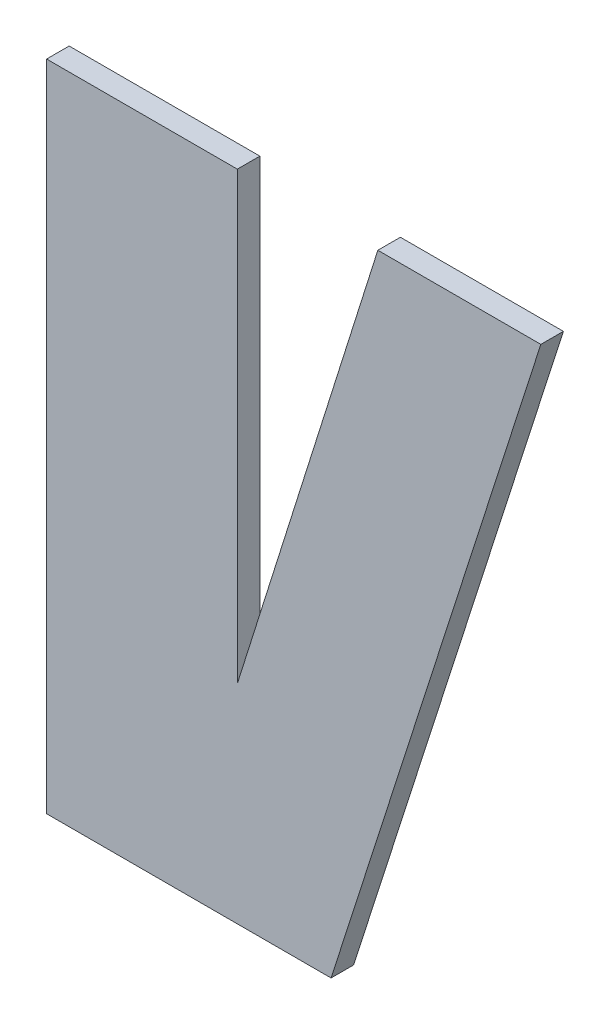
ISO-10303-21;
HEADER;
FILE_DESCRIPTION(('STEP AP214'),'2;1');
FILE_NAME('part.step','',(''),(''),'','','');
FILE_SCHEMA(('AUTOMOTIVE_DESIGN { 1 0 10303 214 1 1 1 1 }'));
ENDSEC;
DATA;
#1=APPLICATION_CONTEXT('core data for automotive mechanical design processes');
#2=APPLICATION_PROTOCOL_DEFINITION('international standard','automotive_design',2000,#1);
#3=PRODUCT_CONTEXT('',#1,'mechanical');
#4=PRODUCT('Part','Part','',(#3));
#5=PRODUCT_RELATED_PRODUCT_CATEGORY('part','',(#4));
#6=PRODUCT_DEFINITION_FORMATION('','',#4);
#7=PRODUCT_DEFINITION_CONTEXT('part definition',#1,'design');
#8=PRODUCT_DEFINITION('design','',#6,#7);
#9=PRODUCT_DEFINITION_SHAPE('','',#8);
#10=(LENGTH_UNIT() NAMED_UNIT(*) SI_UNIT(.MILLI.,.METRE.));
#11=(NAMED_UNIT(*) PLANE_ANGLE_UNIT() SI_UNIT($,.RADIAN.));
#12=(NAMED_UNIT(*) SI_UNIT($,.STERADIAN.) SOLID_ANGLE_UNIT());
#13=UNCERTAINTY_MEASURE_WITH_UNIT(LENGTH_MEASURE(1.E-05),#10,'distance_accuracy_value','');
#14=(GEOMETRIC_REPRESENTATION_CONTEXT(3) GLOBAL_UNCERTAINTY_ASSIGNED_CONTEXT((#13)) GLOBAL_UNIT_ASSIGNED_CONTEXT((#10,
#11,#12)) REPRESENTATION_CONTEXT('',''));
#15=CARTESIAN_POINT('',(0.,0.,0.));
#16=DIRECTION('',(0.,0.,1.));
#17=DIRECTION('',(1.,0.,0.));
#18=AXIS2_PLACEMENT_3D('',#15,#16,#17);
#19=CARTESIAN_POINT('',(-8.22836538461745,-15.,0.5));
#20=DIRECTION('',(0.,1.,0.));
#21=DIRECTION('',(0.,0.,1.));
#22=AXIS2_PLACEMENT_3D('',#19,#20,#21);
#23=PLANE('',#22);
#24=DIRECTION('',(-1.,0.,0.));
#25=VECTOR('',#24,1.);
#26=CARTESIAN_POINT('',(-8.22836538461745,-15.,1.));
#27=LINE('',#26,#25);
#28=CARTESIAN_POINT('',(-8.22836538461745,-15.,1.));
#29=VERTEX_POINT('',#28);
#30=CARTESIAN_POINT('',(-14.5384615384636,-15.,1.));
#31=VERTEX_POINT('',#30);
#32=EDGE_CURVE('E145',#29,#31,#27,.T.);
#33=ORIENTED_EDGE('',*,*,#32,.T.);
#34=DIRECTION('',(0.,0.,1.));
#35=VECTOR('',#34,1.);
#36=CARTESIAN_POINT('',(-14.5384615384636,-15.,0.5));
#37=LINE('',#36,#35);
#38=CARTESIAN_POINT('',(-14.5384615384636,-15.,0.5));
#39=VERTEX_POINT('',#38);
#40=EDGE_CURVE('E132',#39,#31,#37,.T.);
#41=ORIENTED_EDGE('',*,*,#40,.F.);
#42=DIRECTION('',(-1.,0.,0.));
#43=VECTOR('',#42,1.);
#44=CARTESIAN_POINT('',(-8.22836538461745,-15.,0.5));
#45=LINE('',#44,#43);
#46=CARTESIAN_POINT('',(-8.22836538461745,-15.,0.5));
#47=VERTEX_POINT('',#46);
#48=EDGE_CURVE('E140',#47,#39,#45,.T.);
#49=ORIENTED_EDGE('',*,*,#48,.F.);
#50=DIRECTION('',(0.,0.,1.));
#51=VECTOR('',#50,1.);
#52=CARTESIAN_POINT('',(-8.22836538461745,-15.,0.5));
#53=LINE('',#52,#51);
#54=EDGE_CURVE('E142',#47,#29,#53,.T.);
#55=ORIENTED_EDGE('',*,*,#54,.T.);
#56=EDGE_LOOP('',(#33,#41,#49,#55));
#57=FACE_BOUND('',#56,.T.);
#58=ADVANCED_FACE('F39',(#57),#23,.F.);
#59=CARTESIAN_POINT('',(0.551180523599077,8.25129500228357,0.5));
#60=DIRECTION('',(0.,0.,-1.));
#61=DIRECTION('',(-1.,0.,0.));
#62=AXIS2_PLACEMENT_3D('',#59,#60,#61);
#63=PLANE('',#62);
#64=DIRECTION('',(-1.,0.,0.));
#65=VECTOR('',#64,1.);
#66=CARTESIAN_POINT('',(0.551180523599077,-0.5,0.499999999999894));
#67=LINE('',#66,#65);
#68=CARTESIAN_POINT('',(-3.57472030764969,-0.5,0.499999999999866));
#69=VERTEX_POINT('',#68);
#70=CARTESIAN_POINT('',(-7.19066870629577,-0.5,0.499999999999796));
#71=VERTEX_POINT('',#70);
#72=EDGE_CURVE('E11',#69,#71,#67,.T.);
#73=ORIENTED_EDGE('',*,*,#72,.F.);
#74=DIRECTION('',(-0.305588409967658,-0.952163706351717,0.));
#75=VECTOR('',#74,1.);
#76=CARTESIAN_POINT('',(-1.58774038461745,5.69110576923077,0.5));
#77=LINE('',#76,#75);
#78=EDGE_CURVE('E116',#69,#47,#77,.T.);
#79=ORIENTED_EDGE('',*,*,#78,.T.);
#80=ORIENTED_EDGE('',*,*,#48,.T.);
#81=DIRECTION('',(0.,1.,0.));
#82=VECTOR('',#81,1.);
#83=CARTESIAN_POINT('',(-14.5384615384636,-15.,0.5));
#84=LINE('',#83,#82);
#85=CARTESIAN_POINT('',(-14.5384615384636,-0.5,0.499999999999303));
#86=VERTEX_POINT('',#85);
#87=EDGE_CURVE('E137',#39,#86,#84,.T.);
#88=ORIENTED_EDGE('',*,*,#87,.T.);
#89=CARTESIAN_POINT('',(-10.3076923076944,-0.5,0.5));
#90=VERTEX_POINT('',#89);
#91=EDGE_CURVE('E47',#90,#86,#67,.T.);
#92=ORIENTED_EDGE('',*,*,#91,.F.);
#93=DIRECTION('',(0.,-1.,0.));
#94=VECTOR('',#93,1.);
#95=CARTESIAN_POINT('',(-10.3076923076944,15.,0.5));
#96=LINE('',#95,#94);
#97=CARTESIAN_POINT('',(-10.3076923076944,-10.3846153846154,0.5));
#98=VERTEX_POINT('',#97);
#99=EDGE_CURVE('E43',#90,#98,#96,.T.);
#100=ORIENTED_EDGE('',*,*,#99,.T.);
#101=DIRECTION('',(0.300742337202367,0.953705429686786,0.));
#102=VECTOR('',#101,1.);
#103=CARTESIAN_POINT('',(-10.3076923076944,-10.3846153846154,0.5));
#104=LINE('',#103,#102);
#105=EDGE_CURVE('E114',#98,#71,#104,.T.);
#106=ORIENTED_EDGE('',*,*,#105,.T.);
#107=EDGE_LOOP('',(#73,#79,#80,#88,#92,#100,#106));
#108=FACE_BOUND('',#107,.T.);
#109=ADVANCED_FACE('F155',(#108),#63,.T.);
#110=CARTESIAN_POINT('',(-10.3076923076944,-10.3846153846154,0.5));
#111=DIRECTION('',(0.953705429686786,-0.300742337202367,0.));
#112=DIRECTION('',(0.300742337202367,0.953705429686786,0.));
#113=AXIS2_PLACEMENT_3D('',#110,#111,#112);
#114=PLANE('',#113);
#115=DIRECTION('',(0.300742337202367,0.953705429686786,0.));
#116=VECTOR('',#115,1.);
#117=CARTESIAN_POINT('',(-10.3076923076944,-10.3846153846154,1.));
#118=LINE('',#117,#116);
#119=CARTESIAN_POINT('',(-10.3076923076944,-10.3846153846154,1.));
#120=VERTEX_POINT('',#119);
#121=CARTESIAN_POINT('',(-7.19066870629577,-0.5,1.));
#122=VERTEX_POINT('',#121);
#123=EDGE_CURVE('E99',#120,#122,#118,.T.);
#124=ORIENTED_EDGE('',*,*,#123,.T.);
#125=DIRECTION('',(0.,0.,-1.));
#126=VECTOR('',#125,1.);
#127=CARTESIAN_POINT('',(-7.19066870629577,-0.5,0.5));
#128=LINE('',#127,#126);
#129=EDGE_CURVE('E95',#122,#71,#128,.T.);
#130=ORIENTED_EDGE('',*,*,#129,.T.);
#131=ORIENTED_EDGE('',*,*,#105,.F.);
#132=DIRECTION('',(0.,0.,1.));
#133=VECTOR('',#132,1.);
#134=CARTESIAN_POINT('',(-10.3076923076944,-10.3846153846154,0.5));
#135=LINE('',#134,#133);
#136=EDGE_CURVE('E98',#98,#120,#135,.T.);
#137=ORIENTED_EDGE('',*,*,#136,.T.);
#138=EDGE_LOOP('',(#124,#130,#131,#137));
#139=FACE_BOUND('',#138,.T.);
#140=ADVANCED_FACE('F115',(#139),#114,.F.);
#141=CARTESIAN_POINT('',(-10.3076923076944,15.,0.5));
#142=DIRECTION('',(-1.,0.,0.));
#143=DIRECTION('',(0.,0.,1.));
#144=AXIS2_PLACEMENT_3D('',#141,#142,#143);
#145=PLANE('',#144);
#146=ORIENTED_EDGE('',*,*,#99,.F.);
#147=DIRECTION('',(0.,0.,1.));
#148=VECTOR('',#147,1.);
#149=CARTESIAN_POINT('',(-10.3076923076944,-0.5,0.5));
#150=LINE('',#149,#148);
#151=CARTESIAN_POINT('',(-10.3076923076944,-0.5,1.));
#152=VERTEX_POINT('',#151);
#153=EDGE_CURVE('E122',#90,#152,#150,.T.);
#154=ORIENTED_EDGE('',*,*,#153,.T.);
#155=DIRECTION('',(0.,-1.,0.));
#156=VECTOR('',#155,1.);
#157=CARTESIAN_POINT('',(-10.3076923076944,15.,1.));
#158=LINE('',#157,#156);
#159=EDGE_CURVE('E118',#152,#120,#158,.T.);
#160=ORIENTED_EDGE('',*,*,#159,.T.);
#161=ORIENTED_EDGE('',*,*,#136,.F.);
#162=EDGE_LOOP('',(#146,#154,#160,#161));
#163=FACE_BOUND('',#162,.T.);
#164=ADVANCED_FACE('F165',(#163),#145,.F.);
#165=CARTESIAN_POINT('',(-14.5384615384636,-15.,0.5));
#166=DIRECTION('',(1.,0.,0.));
#167=DIRECTION('',(0.,0.,-1.));
#168=AXIS2_PLACEMENT_3D('',#165,#166,#167);
#169=PLANE('',#168);
#170=DIRECTION('',(0.,1.,0.));
#171=VECTOR('',#170,1.);
#172=CARTESIAN_POINT('',(-14.5384615384636,-15.,1.));
#173=LINE('',#172,#171);
#174=CARTESIAN_POINT('',(-14.5384615384636,-0.5,1.));
#175=VERTEX_POINT('',#174);
#176=EDGE_CURVE('E123',#31,#175,#173,.T.);
#177=ORIENTED_EDGE('',*,*,#176,.T.);
#178=DIRECTION('',(0.,0.,-1.));
#179=VECTOR('',#178,1.);
#180=CARTESIAN_POINT('',(-14.5384615384636,-0.5,0.5));
#181=LINE('',#180,#179);
#182=EDGE_CURVE('E128',#175,#86,#181,.T.);
#183=ORIENTED_EDGE('',*,*,#182,.T.);
#184=ORIENTED_EDGE('',*,*,#87,.F.);
#185=ORIENTED_EDGE('',*,*,#40,.T.);
#186=EDGE_LOOP('',(#177,#183,#184,#185));
#187=FACE_BOUND('',#186,.T.);
#188=ADVANCED_FACE('F158',(#187),#169,.F.);
#189=CARTESIAN_POINT('',(-1.58774038461745,5.69110576923077,0.5));
#190=DIRECTION('',(-0.952163706351717,0.305588409967658,0.));
#191=DIRECTION('',(-0.305588409967658,-0.952163706351717,0.));
#192=AXIS2_PLACEMENT_3D('',#189,#190,#191);
#193=PLANE('',#192);
#194=ORIENTED_EDGE('',*,*,#78,.F.);
#195=DIRECTION('',(0.,0.,1.));
#196=VECTOR('',#195,1.);
#197=CARTESIAN_POINT('',(-3.57472030764969,-0.5,0.5));
#198=LINE('',#197,#196);
#199=CARTESIAN_POINT('',(-3.57472030764969,-0.5,1.));
#200=VERTEX_POINT('',#199);
#201=EDGE_CURVE('E57',#69,#200,#198,.T.);
#202=ORIENTED_EDGE('',*,*,#201,.T.);
#203=DIRECTION('',(-0.305588409967658,-0.952163706351717,0.));
#204=VECTOR('',#203,1.);
#205=CARTESIAN_POINT('',(-1.58774038461745,5.69110576923077,1.));
#206=LINE('',#205,#204);
#207=EDGE_CURVE('E110',#200,#29,#206,.T.);
#208=ORIENTED_EDGE('',*,*,#207,.T.);
#209=ORIENTED_EDGE('',*,*,#54,.F.);
#210=EDGE_LOOP('',(#194,#202,#208,#209));
#211=FACE_BOUND('',#210,.T.);
#212=ADVANCED_FACE('F157',(#211),#193,.F.);
#213=CARTESIAN_POINT('',(0.551180523599077,8.25129500228357,1.));
#214=DIRECTION('',(0.,0.,-1.));
#215=DIRECTION('',(-1.,0.,0.));
#216=AXIS2_PLACEMENT_3D('',#213,#214,#215);
#217=PLANE('',#216);
#218=ORIENTED_EDGE('',*,*,#207,.F.);
#219=DIRECTION('',(-1.,0.,0.));
#220=VECTOR('',#219,1.);
#221=CARTESIAN_POINT('',(-17.,-0.5,1.));
#222=LINE('',#221,#220);
#223=EDGE_CURVE('E92',#200,#122,#222,.T.);
#224=ORIENTED_EDGE('',*,*,#223,.T.);
#225=ORIENTED_EDGE('',*,*,#123,.F.);
#226=ORIENTED_EDGE('',*,*,#159,.F.);
#227=EDGE_CURVE('E106',#152,#175,#222,.T.);
#228=ORIENTED_EDGE('',*,*,#227,.T.);
#229=ORIENTED_EDGE('',*,*,#176,.F.);
#230=ORIENTED_EDGE('',*,*,#32,.F.);
#231=EDGE_LOOP('',(#218,#224,#225,#226,#228,#229,#230));
#232=FACE_BOUND('',#231,.T.);
#233=ADVANCED_FACE('F103',(#232),#217,.F.);
#234=CARTESIAN_POINT('',(-17.,-0.5,1.));
#235=DIRECTION('',(0.,-1.,0.));
#236=DIRECTION('',(0.,0.,-1.));
#237=AXIS2_PLACEMENT_3D('',#234,#235,#236);
#238=PLANE('',#237);
#239=ORIENTED_EDGE('',*,*,#227,.F.);
#240=ORIENTED_EDGE('',*,*,#153,.F.);
#241=ORIENTED_EDGE('',*,*,#91,.T.);
#242=ORIENTED_EDGE('',*,*,#182,.F.);
#243=EDGE_LOOP('',(#239,#240,#241,#242));
#244=FACE_BOUND('',#243,.T.);
#245=ADVANCED_FACE('F184',(#244),#238,.F.);
#246=ORIENTED_EDGE('',*,*,#72,.T.);
#247=ORIENTED_EDGE('',*,*,#129,.F.);
#248=ORIENTED_EDGE('',*,*,#223,.F.);
#249=ORIENTED_EDGE('',*,*,#201,.F.);
#250=EDGE_LOOP('',(#246,#247,#248,#249));
#251=FACE_BOUND('',#250,.T.);
#252=ADVANCED_FACE('F41',(#251),#238,.F.);
#253=CLOSED_SHELL('',(#58,#109,#140,#164,#188,#212,#233,#245,#252));
#254=MANIFOLD_SOLID_BREP('B2',#253);
#255=ADVANCED_BREP_SHAPE_REPRESENTATION('',(#18,#254),#14);
#256=SHAPE_DEFINITION_REPRESENTATION(#9,#255);
ENDSEC;
END-ISO-10303-21;
